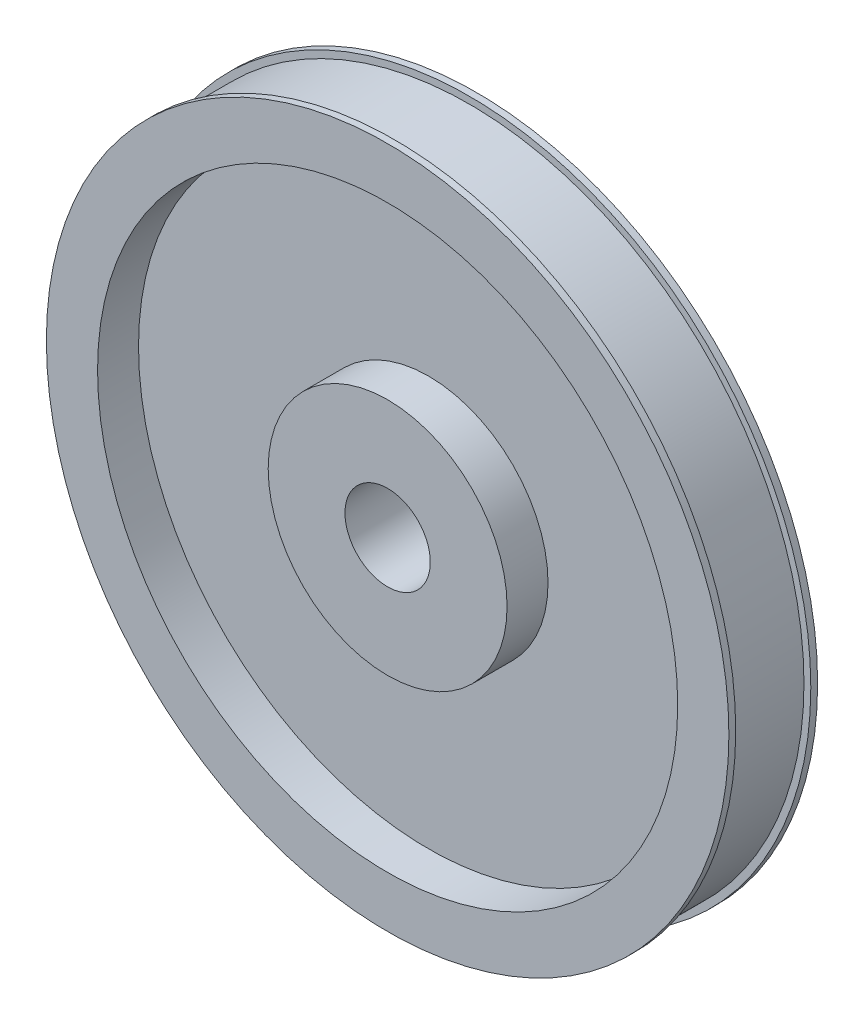
ISO-10303-21;
HEADER;
FILE_DESCRIPTION(('STEP AP214'),'2;1');
FILE_NAME('part.step','',(''),(''),'','','');
FILE_SCHEMA(('AUTOMOTIVE_DESIGN { 1 0 10303 214 1 1 1 1 }'));
ENDSEC;
DATA;
#1=APPLICATION_CONTEXT('core data for automotive mechanical design processes');
#2=APPLICATION_PROTOCOL_DEFINITION('international standard','automotive_design',2000,#1);
#3=PRODUCT_CONTEXT('',#1,'mechanical');
#4=PRODUCT('Part','Part','',(#3));
#5=PRODUCT_RELATED_PRODUCT_CATEGORY('part','',(#4));
#6=PRODUCT_DEFINITION_FORMATION('','',#4);
#7=PRODUCT_DEFINITION_CONTEXT('part definition',#1,'design');
#8=PRODUCT_DEFINITION('design','',#6,#7);
#9=PRODUCT_DEFINITION_SHAPE('','',#8);
#10=(LENGTH_UNIT() NAMED_UNIT(*) SI_UNIT(.MILLI.,.METRE.));
#11=(NAMED_UNIT(*) PLANE_ANGLE_UNIT() SI_UNIT($,.RADIAN.));
#12=(NAMED_UNIT(*) SI_UNIT($,.STERADIAN.) SOLID_ANGLE_UNIT());
#13=UNCERTAINTY_MEASURE_WITH_UNIT(LENGTH_MEASURE(1.E-05),#10,'distance_accuracy_value','');
#14=(GEOMETRIC_REPRESENTATION_CONTEXT(3) GLOBAL_UNCERTAINTY_ASSIGNED_CONTEXT((#13)) GLOBAL_UNIT_ASSIGNED_CONTEXT((#10,
#11,#12)) REPRESENTATION_CONTEXT('',''));
#15=CARTESIAN_POINT('',(0.,0.,0.));
#16=DIRECTION('',(0.,0.,1.));
#17=DIRECTION('',(1.,0.,0.));
#18=AXIS2_PLACEMENT_3D('',#15,#16,#17);
#19=CARTESIAN_POINT('',(0.,0.,26.));
#20=DIRECTION('',(0.,0.,1.));
#21=DIRECTION('',(1.,0.,0.));
#22=AXIS2_PLACEMENT_3D('',#19,#20,#21);
#23=PLANE('',#22);
#24=CARTESIAN_POINT('',(0.,0.,26.));
#25=DIRECTION('',(0.,0.,-1.));
#26=DIRECTION('',(-1.,0.,0.));
#27=AXIS2_PLACEMENT_3D('',#24,#25,#26);
#28=CIRCLE('',#27,12.5);
#29=CARTESIAN_POINT('',(-12.5,0.,26.));
#30=VERTEX_POINT('',#29);
#31=EDGE_CURVE('E61',#30,#30,#28,.T.);
#32=ORIENTED_EDGE('',*,*,#31,.T.);
#33=EDGE_LOOP('',(#32));
#34=FACE_BOUND('',#33,.T.);
#35=CARTESIAN_POINT('',(0.,0.,26.));
#36=DIRECTION('',(0.,0.,1.));
#37=DIRECTION('',(1.,0.,0.));
#38=AXIS2_PLACEMENT_3D('',#35,#36,#37);
#39=CIRCLE('',#38,35.);
#40=CARTESIAN_POINT('',(35.,0.,26.));
#41=VERTEX_POINT('',#40);
#42=EDGE_CURVE('E73',#41,#41,#39,.T.);
#43=ORIENTED_EDGE('',*,*,#42,.T.);
#44=EDGE_LOOP('',(#43));
#45=FACE_BOUND('',#44,.T.);
#46=ADVANCED_FACE('F32',(#34,#45),#23,.T.);
#47=CARTESIAN_POINT('',(0.,0.,26.));
#48=DIRECTION('',(0.,0.,-1.));
#49=DIRECTION('',(-1.,0.,0.));
#50=AXIS2_PLACEMENT_3D('',#47,#48,#49);
#51=CYLINDRICAL_SURFACE('',#50,12.5);
#52=CARTESIAN_POINT('',(0.,0.,0.));
#53=DIRECTION('',(0.,0.,1.));
#54=DIRECTION('',(1.,0.,0.));
#55=AXIS2_PLACEMENT_3D('',#52,#53,#54);
#56=CIRCLE('',#55,12.5);
#57=CARTESIAN_POINT('',(-12.5,0.,0.));
#58=VERTEX_POINT('',#57);
#59=EDGE_CURVE('E40',#58,#58,#56,.T.);
#60=CARTESIAN_POINT('',(-12.5,0.,0.));
#61=CARTESIAN_POINT('',(-12.5,0.,0.270833333333333));
#62=CARTESIAN_POINT('',(-12.5,0.,0.541666666666667));
#63=CARTESIAN_POINT('',(-12.5,0.,1.08333333333333));
#64=CARTESIAN_POINT('',(-12.5,0.,1.35416666666667));
#65=CARTESIAN_POINT('',(-12.5,0.,1.89583333333333));
#66=CARTESIAN_POINT('',(-12.5,0.,2.16666666666667));
#67=CARTESIAN_POINT('',(-12.5,0.,2.70833333333333));
#68=CARTESIAN_POINT('',(-12.5,0.,2.97916666666667));
#69=CARTESIAN_POINT('',(-12.5,0.,3.52083333333333));
#70=CARTESIAN_POINT('',(-12.5,0.,3.79166666666667));
#71=CARTESIAN_POINT('',(-12.5,0.,4.33333333333333));
#72=CARTESIAN_POINT('',(-12.5,0.,4.60416666666667));
#73=CARTESIAN_POINT('',(-12.5,0.,5.14583333333333));
#74=CARTESIAN_POINT('',(-12.5,0.,5.41666666666667));
#75=CARTESIAN_POINT('',(-12.5,0.,5.95833333333333));
#76=CARTESIAN_POINT('',(-12.5,0.,6.22916666666667));
#77=CARTESIAN_POINT('',(-12.5,0.,6.77083333333333));
#78=CARTESIAN_POINT('',(-12.5,0.,7.04166666666667));
#79=CARTESIAN_POINT('',(-12.5,0.,7.58333333333333));
#80=CARTESIAN_POINT('',(-12.5,0.,7.85416666666667));
#81=CARTESIAN_POINT('',(-12.5,0.,8.39583333333333));
#82=CARTESIAN_POINT('',(-12.5,0.,8.66666666666667));
#83=CARTESIAN_POINT('',(-12.5,0.,9.20833333333333));
#84=CARTESIAN_POINT('',(-12.5,0.,9.47916666666667));
#85=CARTESIAN_POINT('',(-12.5,0.,10.0208333333333));
#86=CARTESIAN_POINT('',(-12.5,0.,10.2916666666667));
#87=CARTESIAN_POINT('',(-12.5,0.,10.8333333333333));
#88=CARTESIAN_POINT('',(-12.5,0.,11.1041666666667));
#89=CARTESIAN_POINT('',(-12.5,0.,11.6458333333333));
#90=CARTESIAN_POINT('',(-12.5,0.,11.9166666666667));
#91=CARTESIAN_POINT('',(-12.5,0.,12.4583333333333));
#92=CARTESIAN_POINT('',(-12.5,0.,12.7291666666667));
#93=CARTESIAN_POINT('',(-12.5,0.,13.2708333333333));
#94=CARTESIAN_POINT('',(-12.5,0.,13.5416666666667));
#95=CARTESIAN_POINT('',(-12.5,0.,14.0833333333333));
#96=CARTESIAN_POINT('',(-12.5,0.,14.3541666666667));
#97=CARTESIAN_POINT('',(-12.5,0.,14.8958333333333));
#98=CARTESIAN_POINT('',(-12.5,0.,15.1666666666667));
#99=CARTESIAN_POINT('',(-12.5,0.,15.7083333333333));
#100=CARTESIAN_POINT('',(-12.5,0.,15.9791666666667));
#101=CARTESIAN_POINT('',(-12.5,0.,16.5208333333333));
#102=CARTESIAN_POINT('',(-12.5,0.,16.7916666666667));
#103=CARTESIAN_POINT('',(-12.5,0.,17.3333333333333));
#104=CARTESIAN_POINT('',(-12.5,0.,17.6041666666667));
#105=CARTESIAN_POINT('',(-12.5,0.,18.1458333333333));
#106=CARTESIAN_POINT('',(-12.5,0.,18.4166666666667));
#107=CARTESIAN_POINT('',(-12.5,0.,18.9583333333333));
#108=CARTESIAN_POINT('',(-12.5,0.,19.2291666666667));
#109=CARTESIAN_POINT('',(-12.5,0.,19.7708333333333));
#110=CARTESIAN_POINT('',(-12.5,0.,20.0416666666667));
#111=CARTESIAN_POINT('',(-12.5,0.,20.5833333333333));
#112=CARTESIAN_POINT('',(-12.5,0.,20.8541666666667));
#113=CARTESIAN_POINT('',(-12.5,0.,21.3958333333333));
#114=CARTESIAN_POINT('',(-12.5,0.,21.6666666666667));
#115=CARTESIAN_POINT('',(-12.5,0.,22.2083333333333));
#116=CARTESIAN_POINT('',(-12.5,0.,22.4791666666667));
#117=CARTESIAN_POINT('',(-12.5,0.,23.0208333333333));
#118=CARTESIAN_POINT('',(-12.5,0.,23.2916666666667));
#119=CARTESIAN_POINT('',(-12.5,0.,23.8333333333333));
#120=CARTESIAN_POINT('',(-12.5,0.,24.1041666666667));
#121=CARTESIAN_POINT('',(-12.5,0.,24.6458333333333));
#122=CARTESIAN_POINT('',(-12.5,0.,24.9166666666667));
#123=CARTESIAN_POINT('',(-12.5,0.,25.4583333333333));
#124=CARTESIAN_POINT('',(-12.5,0.,25.7291666666667));
#125=CARTESIAN_POINT('',(-12.5,0.,26.));
#126=B_SPLINE_CURVE_WITH_KNOTS('',3,(#60,#61,#62,#63,#64,#65,#66,#67,#68,#69,#70,#71,#72,#73,
#74,#75,#76,#77,#78,#79,#80,#81,#82,#83,#84,#85,#86,#87,#88,#89,#90,#91,#92,#93,#94,#95,#96,#97,
#98,#99,#100,#101,#102,#103,#104,#105,#106,#107,#108,#109,#110,#111,#112,#113,#114,#115,#116,
#117,#118,#119,#120,#121,#122,#123,#124,#125),.UNSPECIFIED.,.F.,.F.,(4,2,2,2,2,2,2,2,2,2,2,2,2,
2,2,2,2,2,2,2,2,2,2,2,2,2,2,2,2,2,2,2,4),(0.,0.812500000000001,1.625,2.4375,3.25,4.0625,4.875,
5.6875,6.5,7.3125,8.125,8.9375,9.75,10.5625,11.375,12.1875,13.,13.8125,14.625,15.4375,16.25,
17.0625,17.875,18.6875,19.5,20.3125,21.125,21.9375,22.75,23.5625,24.375,25.1875,26.),.UNSPECIFIED.);
#127=EDGE_CURVE('BSEAM113',#58,#30,#126,.T.);
#128=ORIENTED_EDGE('',*,*,#59,.F.);
#129=ORIENTED_EDGE('',*,*,#31,.F.);
#130=ORIENTED_EDGE('',*,*,#127,.T.);
#131=ORIENTED_EDGE('',*,*,#127,.F.);
#132=EDGE_LOOP('',(#128,#130,#129,#131));
#133=FACE_BOUND('',#132,.T.);
#134=ADVANCED_FACE('F113',(#133),#51,.F.);
#135=CARTESIAN_POINT('',(0.,0.,2.));
#136=DIRECTION('',(0.,0.,1.));
#137=DIRECTION('',(1.,0.,0.));
#138=AXIS2_PLACEMENT_3D('',#135,#136,#137);
#139=CYLINDRICAL_SURFACE('',#138,98.);
#140=CARTESIAN_POINT('',(0.,0.,2.));
#141=DIRECTION('',(0.,0.,1.));
#142=DIRECTION('',(1.,0.,0.));
#143=AXIS2_PLACEMENT_3D('',#140,#141,#142);
#144=CIRCLE('',#143,98.);
#145=CARTESIAN_POINT('',(98.,0.,2.));
#146=VERTEX_POINT('',#145);
#147=EDGE_CURVE('E49',#146,#146,#144,.T.);
#148=ORIENTED_EDGE('',*,*,#147,.T.);
#149=EDGE_LOOP('',(#148));
#150=FACE_BOUND('',#149,.T.);
#151=CARTESIAN_POINT('',(0.,0.,24.));
#152=DIRECTION('',(0.,0.,1.));
#153=DIRECTION('',(1.,0.,0.));
#154=AXIS2_PLACEMENT_3D('',#151,#152,#153);
#155=CIRCLE('',#154,98.);
#156=CARTESIAN_POINT('',(98.,0.,24.));
#157=VERTEX_POINT('',#156);
#158=EDGE_CURVE('E36',#157,#157,#155,.F.);
#159=ORIENTED_EDGE('',*,*,#158,.T.);
#160=EDGE_LOOP('',(#159));
#161=FACE_BOUND('',#160,.T.);
#162=ADVANCED_FACE('F118',(#150,#161),#139,.T.);
#163=CARTESIAN_POINT('',(0.,0.,26.));
#164=DIRECTION('',(0.,0.,-1.));
#165=DIRECTION('',(-1.,0.,0.));
#166=AXIS2_PLACEMENT_3D('',#163,#164,#165);
#167=CYLINDRICAL_SURFACE('',#166,100.);
#168=CARTESIAN_POINT('',(0.,0.,0.));
#169=DIRECTION('',(0.,0.,1.));
#170=DIRECTION('',(1.,0.,0.));
#171=AXIS2_PLACEMENT_3D('',#168,#169,#170);
#172=CIRCLE('',#171,100.);
#173=CARTESIAN_POINT('',(-100.,0.,0.));
#174=VERTEX_POINT('',#173);
#175=EDGE_CURVE('E11',#174,#174,#172,.T.);
#176=CARTESIAN_POINT('',(0.,0.,2.));
#177=DIRECTION('',(0.,0.,1.));
#178=DIRECTION('',(1.,0.,0.));
#179=AXIS2_PLACEMENT_3D('',#176,#177,#178);
#180=CIRCLE('',#179,100.);
#181=CARTESIAN_POINT('',(-100.,0.,1.99999999999999));
#182=VERTEX_POINT('',#181);
#183=EDGE_CURVE('E45',#182,#182,#180,.T.);
#184=CARTESIAN_POINT('',(-100.,0.,0.));
#185=CARTESIAN_POINT('',(-100.,0.,0.0208333333333333));
#186=CARTESIAN_POINT('',(-100.,0.,0.0416666666666667));
#187=CARTESIAN_POINT('',(-100.,0.,0.0833333333333334));
#188=CARTESIAN_POINT('',(-100.,0.,0.104166666666667));
#189=CARTESIAN_POINT('',(-100.,0.,0.145833333333333));
#190=CARTESIAN_POINT('',(-100.,0.,0.166666666666667));
#191=CARTESIAN_POINT('',(-100.,0.,0.208333333333334));
#192=CARTESIAN_POINT('',(-100.,0.,0.229166666666667));
#193=CARTESIAN_POINT('',(-100.,0.,0.270833333333334));
#194=CARTESIAN_POINT('',(-100.,0.,0.291666666666667));
#195=CARTESIAN_POINT('',(-100.,0.,0.333333333333334));
#196=CARTESIAN_POINT('',(-100.,0.,0.354166666666667));
#197=CARTESIAN_POINT('',(-100.,0.,0.395833333333334));
#198=CARTESIAN_POINT('',(-100.,0.,0.416666666666667));
#199=CARTESIAN_POINT('',(-100.,0.,0.458333333333334));
#200=CARTESIAN_POINT('',(-100.,0.,0.479166666666667));
#201=CARTESIAN_POINT('',(-100.,0.,0.520833333333333));
#202=CARTESIAN_POINT('',(-100.,0.,0.541666666666665));
#203=CARTESIAN_POINT('',(-100.,0.,0.58333333333333));
#204=CARTESIAN_POINT('',(-100.,0.,0.604166666666664));
#205=CARTESIAN_POINT('',(-100.,0.,0.64583333333333));
#206=CARTESIAN_POINT('',(-100.,0.,0.666666666666664));
#207=CARTESIAN_POINT('',(-100.,0.,0.70833333333333));
#208=CARTESIAN_POINT('',(-100.,0.,0.729166666666664));
#209=CARTESIAN_POINT('',(-100.,0.,0.77083333333333));
#210=CARTESIAN_POINT('',(-100.,0.,0.791666666666664));
#211=CARTESIAN_POINT('',(-100.,0.,0.833333333333331));
#212=CARTESIAN_POINT('',(-100.,0.,0.854166666666664));
#213=CARTESIAN_POINT('',(-100.,0.,0.895833333333331));
#214=CARTESIAN_POINT('',(-100.,0.,0.916666666666664));
#215=CARTESIAN_POINT('',(-100.,0.,0.958333333333331));
#216=CARTESIAN_POINT('',(-100.,0.,0.979166666666664));
#217=CARTESIAN_POINT('',(-100.,0.,1.02083333333333));
#218=CARTESIAN_POINT('',(-100.,0.,1.04166666666666));
#219=CARTESIAN_POINT('',(-100.,0.,1.08333333333333));
#220=CARTESIAN_POINT('',(-100.,0.,1.10416666666666));
#221=CARTESIAN_POINT('',(-100.,0.,1.14583333333333));
#222=CARTESIAN_POINT('',(-100.,0.,1.16666666666666));
#223=CARTESIAN_POINT('',(-100.,0.,1.20833333333333));
#224=CARTESIAN_POINT('',(-100.,0.,1.22916666666666));
#225=CARTESIAN_POINT('',(-100.,0.,1.27083333333333));
#226=CARTESIAN_POINT('',(-100.,0.,1.29166666666666));
#227=CARTESIAN_POINT('',(-100.,0.,1.33333333333333));
#228=CARTESIAN_POINT('',(-100.,0.,1.35416666666666));
#229=CARTESIAN_POINT('',(-100.,0.,1.39583333333333));
#230=CARTESIAN_POINT('',(-100.,0.,1.41666666666666));
#231=CARTESIAN_POINT('',(-100.,0.,1.45833333333333));
#232=CARTESIAN_POINT('',(-100.,0.,1.47916666666666));
#233=CARTESIAN_POINT('',(-100.,0.,1.52083333333333));
#234=CARTESIAN_POINT('',(-100.,0.,1.54166666666666));
#235=CARTESIAN_POINT('',(-100.,0.,1.58333333333333));
#236=CARTESIAN_POINT('',(-100.,0.,1.60416666666666));
#237=CARTESIAN_POINT('',(-100.,0.,1.64583333333333));
#238=CARTESIAN_POINT('',(-100.,0.,1.66666666666666));
#239=CARTESIAN_POINT('',(-100.,0.,1.70833333333333));
#240=CARTESIAN_POINT('',(-100.,0.,1.72916666666666));
#241=CARTESIAN_POINT('',(-100.,0.,1.77083333333333));
#242=CARTESIAN_POINT('',(-100.,0.,1.79166666666666));
#243=CARTESIAN_POINT('',(-100.,0.,1.83333333333333));
#244=CARTESIAN_POINT('',(-100.,0.,1.85416666666666));
#245=CARTESIAN_POINT('',(-100.,0.,1.89583333333333));
#246=CARTESIAN_POINT('',(-100.,0.,1.91666666666666));
#247=CARTESIAN_POINT('',(-100.,0.,1.95833333333333));
#248=CARTESIAN_POINT('',(-100.,0.,1.97916666666666));
#249=CARTESIAN_POINT('',(-100.,0.,1.99999999999999));
#250=B_SPLINE_CURVE_WITH_KNOTS('',3,(#184,#185,#186,#187,#188,#189,#190,#191,#192,#193,#194,
#195,#196,#197,#198,#199,#200,#201,#202,#203,#204,#205,#206,#207,#208,#209,#210,#211,#212,#213,
#214,#215,#216,#217,#218,#219,#220,#221,#222,#223,#224,#225,#226,#227,#228,#229,#230,#231,#232,
#233,#234,#235,#236,#237,#238,#239,#240,#241,#242,#243,#244,#245,#246,#247,#248,#249),
.UNSPECIFIED.,.F.,.F.,(4,2,2,2,2,2,2,2,2,2,2,2,2,2,2,2,2,2,2,2,2,2,2,2,2,2,2,2,2,2,2,2,4),(0.,
0.0625000000000001,0.125,0.1875,0.25,0.3125,0.375,0.4375,0.5,0.562499999999997,
0.624999999999997,0.687499999999997,0.749999999999997,0.812499999999997,0.874999999999997,
0.937499999999997,0.999999999999997,1.0625,1.125,1.1875,1.25,1.3125,1.375,1.4375,
1.49999999999999,1.56249999999999,1.62499999999999,1.68749999999999,1.74999999999999,
1.81249999999999,1.87499999999999,1.93749999999999,1.99999999999999),.UNSPECIFIED.);
#251=EDGE_CURVE('BSEAM34',#174,#182,#250,.T.);
#252=ORIENTED_EDGE('',*,*,#175,.T.);
#253=ORIENTED_EDGE('',*,*,#183,.F.);
#254=ORIENTED_EDGE('',*,*,#251,.T.);
#255=ORIENTED_EDGE('',*,*,#251,.F.);
#256=EDGE_LOOP('',(#252,#254,#253,#255));
#257=FACE_BOUND('',#256,.T.);
#258=ADVANCED_FACE('F34',(#257),#167,.T.);
#259=CARTESIAN_POINT('',(0.,0.,0.));
#260=DIRECTION('',(0.,0.,1.));
#261=DIRECTION('',(1.,0.,0.));
#262=AXIS2_PLACEMENT_3D('',#259,#260,#261);
#263=PLANE('',#262);
#264=ORIENTED_EDGE('',*,*,#175,.F.);
#265=EDGE_LOOP('',(#264));
#266=FACE_BOUND('',#265,.T.);
#267=ORIENTED_EDGE('',*,*,#59,.T.);
#268=EDGE_LOOP('',(#267));
#269=FACE_BOUND('',#268,.T.);
#270=ADVANCED_FACE('F123',(#266,#269),#263,.F.);
#271=CARTESIAN_POINT('',(0.,0.,2.));
#272=DIRECTION('',(0.,0.,1.));
#273=DIRECTION('',(1.,0.,0.));
#274=AXIS2_PLACEMENT_3D('',#271,#272,#273);
#275=PLANE('',#274);
#276=ORIENTED_EDGE('',*,*,#147,.F.);
#277=EDGE_LOOP('',(#276));
#278=FACE_BOUND('',#277,.T.);
#279=ORIENTED_EDGE('',*,*,#183,.T.);
#280=EDGE_LOOP('',(#279));
#281=FACE_BOUND('',#280,.T.);
#282=ADVANCED_FACE('F108',(#278,#281),#275,.T.);
#283=CARTESIAN_POINT('',(0.,0.,24.));
#284=DIRECTION('',(0.,0.,1.));
#285=DIRECTION('',(1.,0.,0.));
#286=AXIS2_PLACEMENT_3D('',#283,#284,#285);
#287=PLANE('',#286);
#288=ORIENTED_EDGE('',*,*,#158,.F.);
#289=EDGE_LOOP('',(#288));
#290=FACE_BOUND('',#289,.T.);
#291=CARTESIAN_POINT('',(0.,0.,24.));
#292=DIRECTION('',(0.,0.,1.));
#293=DIRECTION('',(1.,0.,0.));
#294=AXIS2_PLACEMENT_3D('',#291,#292,#293);
#295=CIRCLE('',#294,100.);
#296=CARTESIAN_POINT('',(100.,0.,24.));
#297=VERTEX_POINT('',#296);
#298=EDGE_CURVE('E56',#297,#297,#295,.T.);
#299=ORIENTED_EDGE('',*,*,#298,.F.);
#300=EDGE_LOOP('',(#299));
#301=FACE_BOUND('',#300,.T.);
#302=ADVANCED_FACE('F102',(#290,#301),#287,.F.);
#303=CARTESIAN_POINT('',(0.,0.,24.));
#304=DIRECTION('',(0.,0.,1.));
#305=DIRECTION('',(1.,0.,0.));
#306=AXIS2_PLACEMENT_3D('',#303,#304,#305);
#307=CYLINDRICAL_SURFACE('',#306,100.);
#308=ORIENTED_EDGE('',*,*,#298,.T.);
#309=EDGE_LOOP('',(#308));
#310=FACE_BOUND('',#309,.T.);
#311=CARTESIAN_POINT('',(0.,0.,26.));
#312=DIRECTION('',(0.,0.,1.));
#313=DIRECTION('',(1.,0.,0.));
#314=AXIS2_PLACEMENT_3D('',#311,#312,#313);
#315=CIRCLE('',#314,100.);
#316=CARTESIAN_POINT('',(100.,0.,26.));
#317=VERTEX_POINT('',#316);
#318=EDGE_CURVE('E58',#317,#317,#315,.T.);
#319=ORIENTED_EDGE('',*,*,#318,.F.);
#320=EDGE_LOOP('',(#319));
#321=FACE_BOUND('',#320,.T.);
#322=ADVANCED_FACE('F97',(#310,#321),#307,.T.);
#323=CARTESIAN_POINT('',(0.,0.,26.));
#324=DIRECTION('',(0.,0.,1.));
#325=DIRECTION('',(1.,0.,0.));
#326=AXIS2_PLACEMENT_3D('',#323,#324,#325);
#327=CIRCLE('',#326,85.);
#328=CARTESIAN_POINT('',(85.,0.,26.));
#329=VERTEX_POINT('',#328);
#330=EDGE_CURVE('E67',#329,#329,#327,.T.);
#331=ORIENTED_EDGE('',*,*,#330,.F.);
#332=EDGE_LOOP('',(#331));
#333=FACE_BOUND('',#332,.T.);
#334=ORIENTED_EDGE('',*,*,#318,.T.);
#335=EDGE_LOOP('',(#334));
#336=FACE_BOUND('',#335,.T.);
#337=ADVANCED_FACE('F91',(#333,#336),#23,.T.);
#338=CARTESIAN_POINT('',(0.,0.,14.));
#339=DIRECTION('',(0.,0.,1.));
#340=DIRECTION('',(1.,0.,0.));
#341=AXIS2_PLACEMENT_3D('',#338,#339,#340);
#342=CYLINDRICAL_SURFACE('',#341,85.);
#343=CARTESIAN_POINT('',(0.,0.,14.));
#344=DIRECTION('',(0.,0.,1.));
#345=DIRECTION('',(1.,0.,0.));
#346=AXIS2_PLACEMENT_3D('',#343,#344,#345);
#347=CIRCLE('',#346,85.);
#348=CARTESIAN_POINT('',(85.,0.,14.));
#349=VERTEX_POINT('',#348);
#350=EDGE_CURVE('E66',#349,#349,#347,.T.);
#351=ORIENTED_EDGE('',*,*,#350,.F.);
#352=EDGE_LOOP('',(#351));
#353=FACE_BOUND('',#352,.T.);
#354=ORIENTED_EDGE('',*,*,#330,.T.);
#355=EDGE_LOOP('',(#354));
#356=FACE_BOUND('',#355,.T.);
#357=ADVANCED_FACE('F85',(#353,#356),#342,.F.);
#358=CARTESIAN_POINT('',(0.,0.,14.));
#359=DIRECTION('',(0.,0.,1.));
#360=DIRECTION('',(1.,0.,0.));
#361=AXIS2_PLACEMENT_3D('',#358,#359,#360);
#362=PLANE('',#361);
#363=CARTESIAN_POINT('',(0.,0.,14.));
#364=DIRECTION('',(0.,0.,1.));
#365=DIRECTION('',(1.,0.,0.));
#366=AXIS2_PLACEMENT_3D('',#363,#364,#365);
#367=CIRCLE('',#366,35.);
#368=CARTESIAN_POINT('',(35.,0.,14.));
#369=VERTEX_POINT('',#368);
#370=EDGE_CURVE('E70',#369,#369,#367,.T.);
#371=ORIENTED_EDGE('',*,*,#370,.F.);
#372=EDGE_LOOP('',(#371));
#373=FACE_BOUND('',#372,.T.);
#374=ORIENTED_EDGE('',*,*,#350,.T.);
#375=EDGE_LOOP('',(#374));
#376=FACE_BOUND('',#375,.T.);
#377=ADVANCED_FACE('F82',(#373,#376),#362,.T.);
#378=CARTESIAN_POINT('',(0.,0.,14.));
#379=DIRECTION('',(0.,0.,1.));
#380=DIRECTION('',(1.,0.,0.));
#381=AXIS2_PLACEMENT_3D('',#378,#379,#380);
#382=CYLINDRICAL_SURFACE('',#381,35.);
#383=ORIENTED_EDGE('',*,*,#370,.T.);
#384=EDGE_LOOP('',(#383));
#385=FACE_BOUND('',#384,.T.);
#386=ORIENTED_EDGE('',*,*,#42,.F.);
#387=EDGE_LOOP('',(#386));
#388=FACE_BOUND('',#387,.T.);
#389=ADVANCED_FACE('F79',(#385,#388),#382,.T.);
#390=CLOSED_SHELL('',(#46,#134,#162,#258,#270,#282,#302,#322,#337,#357,#377,#389));
#391=MANIFOLD_SOLID_BREP('B2',#390);
#392=ADVANCED_BREP_SHAPE_REPRESENTATION('',(#18,#391),#14);
#393=SHAPE_DEFINITION_REPRESENTATION(#9,#392);
ENDSEC;
END-ISO-10303-21;
